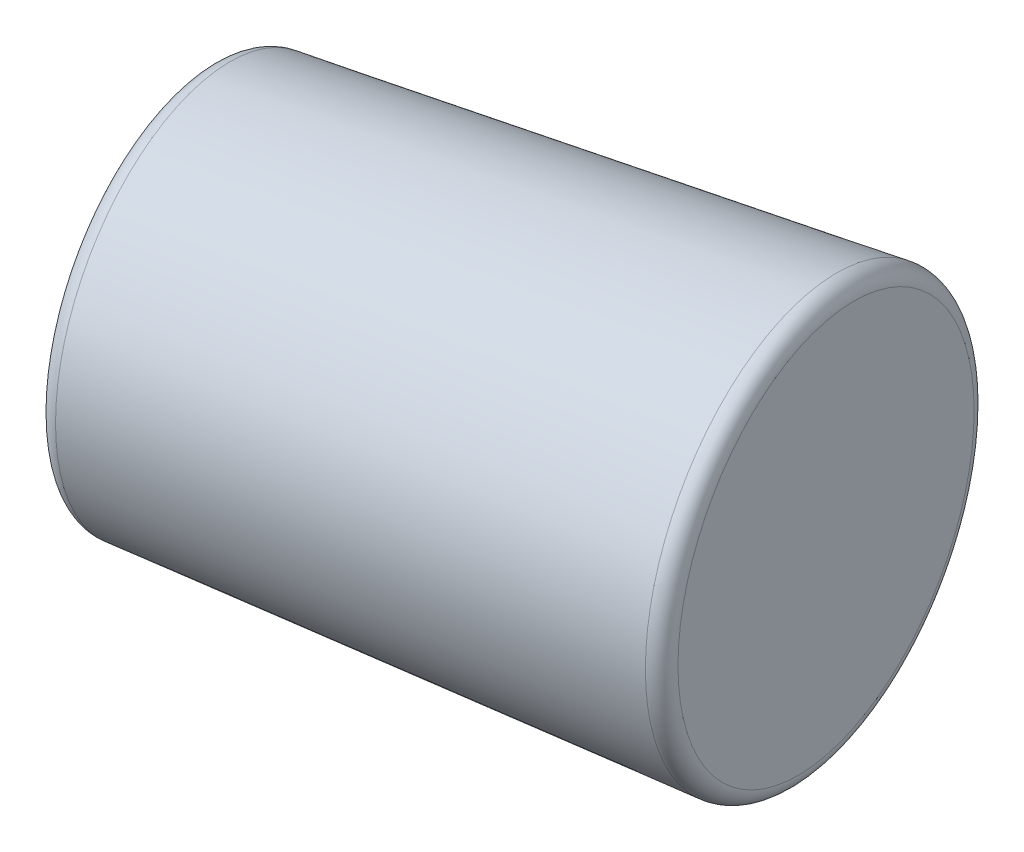
ISO-10303-21;
HEADER;
FILE_DESCRIPTION(('STEP AP214'),'2;1');
FILE_NAME('part.step','',(''),(''),'','','');
FILE_SCHEMA(('AUTOMOTIVE_DESIGN { 1 0 10303 214 1 1 1 1 }'));
ENDSEC;
DATA;
#1=APPLICATION_CONTEXT('core data for automotive mechanical design processes');
#2=APPLICATION_PROTOCOL_DEFINITION('international standard','automotive_design',2000,#1);
#3=PRODUCT_CONTEXT('',#1,'mechanical');
#4=PRODUCT('Part','Part','',(#3));
#5=PRODUCT_RELATED_PRODUCT_CATEGORY('part','',(#4));
#6=PRODUCT_DEFINITION_FORMATION('','',#4);
#7=PRODUCT_DEFINITION_CONTEXT('part definition',#1,'design');
#8=PRODUCT_DEFINITION('design','',#6,#7);
#9=PRODUCT_DEFINITION_SHAPE('','',#8);
#10=(LENGTH_UNIT() NAMED_UNIT(*) SI_UNIT(.MILLI.,.METRE.));
#11=(NAMED_UNIT(*) PLANE_ANGLE_UNIT() SI_UNIT($,.RADIAN.));
#12=(NAMED_UNIT(*) SI_UNIT($,.STERADIAN.) SOLID_ANGLE_UNIT());
#13=UNCERTAINTY_MEASURE_WITH_UNIT(LENGTH_MEASURE(1.E-05),#10,'distance_accuracy_value','');
#14=(GEOMETRIC_REPRESENTATION_CONTEXT(3) GLOBAL_UNCERTAINTY_ASSIGNED_CONTEXT((#13)) GLOBAL_UNIT_ASSIGNED_CONTEXT((#10,
#11,#12)) REPRESENTATION_CONTEXT('',''));
#15=CARTESIAN_POINT('',(0.,0.,0.));
#16=DIRECTION('',(0.,0.,1.));
#17=DIRECTION('',(1.,0.,0.));
#18=AXIS2_PLACEMENT_3D('',#15,#16,#17);
#19=CARTESIAN_POINT('',(3.49874319784223,0.,-20.0504340747262));
#20=DIRECTION('',(-0.981111765721869,0.,0.19344173066357));
#21=DIRECTION('',(0.19344173066357,0.,0.981111765721869));
#22=AXIS2_PLACEMENT_3D('',#19,#20,#21);
#23=PLANE('',#22);
#24=CARTESIAN_POINT('',(3.13077411195753,0.,-21.916726308284));
#25=DIRECTION('',(0.981111765721869,0.,-0.19344173066357));
#26=DIRECTION('',(-0.19344173066357,0.,-0.981111765721869));
#27=AXIS2_PLACEMENT_3D('',#24,#25,#26);
#28=CIRCLE('',#27,3.48254743494994);
#29=CARTESIAN_POINT('',(2.45710410902284,0.,-25.3334945713979));
#30=VERTEX_POINT('',#29);
#31=EDGE_CURVE('E61',#30,#30,#28,.F.);
#32=ORIENTED_EDGE('',*,*,#31,.T.);
#33=EDGE_LOOP('',(#32));
#34=FACE_BOUND('',#33,.T.);
#35=ADVANCED_FACE('F14',(#34),#23,.T.);
#36=CARTESIAN_POINT('',(14.525023724812,0.,-22.0251188623863));
#37=DIRECTION('',(0.981111765721869,0.,-0.19344173066357));
#38=DIRECTION('',(-0.19344173066357,0.,-0.981111765721869));
#39=AXIS2_PLACEMENT_3D('',#36,#37,#38);
#40=PLANE('',#39);
#41=CARTESIAN_POINT('',(14.1192258880425,0.,-24.083273691716));
#42=DIRECTION('',(-0.981111765721869,0.,0.19344173066357));
#43=DIRECTION('',(-0.19344173066357,0.,-0.981111765721869));
#44=AXIS2_PLACEMENT_3D('',#41,#42,#43);
#45=CIRCLE('',#44,3.85037954218825);
#46=CARTESIAN_POINT('',(13.37440180569,0.,-27.8609263630517));
#47=VERTEX_POINT('',#46);
#48=EDGE_CURVE('E29',#47,#47,#45,.F.);
#49=ORIENTED_EDGE('',*,*,#48,.T.);
#50=EDGE_LOOP('',(#49));
#51=FACE_BOUND('',#50,.T.);
#52=ADVANCED_FACE('F73',(#51),#40,.T.);
#53=CARTESIAN_POINT('',(3.45781136392778,0.,-21.9812068845271));
#54=DIRECTION('',(-0.981111765721869,0.,0.19344173066357));
#55=DIRECTION('',(0.,1.,0.));
#56=AXIS2_PLACEMENT_3D('',#53,#54,#55);
#57=TOROIDAL_SURFACE('',#56,3.48254743494994,0.33333333);
#58=ORIENTED_EDGE('',*,*,#31,.F.);
#59=EDGE_LOOP('',(#58));
#60=FACE_BOUND('',#59,.T.);
#61=CARTESIAN_POINT('',(3.44639792839477,0.,-21.9789565448619));
#62=DIRECTION('',(0.981111765721869,0.,-0.19344173066357));
#63=DIRECTION('',(0.193441730663568,0.,0.981111765721869));
#64=AXIS2_PLACEMENT_3D('',#61,#62,#63);
#65=CIRCLE('',#64,3.8156777081402);
#66=CARTESIAN_POINT('',(4.1845092279118,0.,-18.2353502512029));
#67=VERTEX_POINT('',#66);
#68=EDGE_CURVE('E24',#67,#67,#65,.T.);
#69=ORIENTED_EDGE('',*,*,#68,.F.);
#70=EDGE_LOOP('',(#69));
#71=FACE_BOUND('',#70,.T.);
#72=ADVANCED_FACE('F42',(#60,#71),#57,.T.);
#73=CARTESIAN_POINT('',(13.7921886360722,0.,-24.0187931154729));
#74=DIRECTION('',(0.981111765721869,0.,-0.19344173066357));
#75=DIRECTION('',(0.,-1.,0.));
#76=AXIS2_PLACEMENT_3D('',#73,#74,#75);
#77=TOROIDAL_SURFACE('',#76,3.85037954218825,0.333333329999999);
#78=ORIENTED_EDGE('',*,*,#48,.F.);
#79=EDGE_LOOP('',(#78));
#80=FACE_BOUND('',#79,.T.);
#81=CARTESIAN_POINT('',(13.7807752005997,0.,-24.0165427758197));
#82=DIRECTION('',(0.981111765721869,0.,-0.19344173066357));
#83=DIRECTION('',(0.193441730663567,0.,0.981111765721869));
#84=AXIS2_PLACEMENT_3D('',#81,#82,#83);
#85=CIRCLE('',#84,4.18350981368868);
#86=CARTESIAN_POINT('',(14.5900405792077,0.,-19.9120520755969));
#87=VERTEX_POINT('',#86);
#88=EDGE_CURVE('E10',#87,#87,#85,.F.);
#89=ORIENTED_EDGE('',*,*,#88,.F.);
#90=EDGE_LOOP('',(#89));
#91=FACE_BOUND('',#90,.T.);
#92=ADVANCED_FACE('F37',(#80,#91),#77,.T.);
#93=CARTESIAN_POINT('',(13.7807752004876,0.,-24.0165427757976));
#94=DIRECTION('',(0.981111765721869,0.,-0.193441730663568));
#95=DIRECTION('',(-0.193441730663568,0.,-0.981111765721869));
#96=AXIS2_PLACEMENT_3D('',#93,#94,#95);
#97=CONICAL_SURFACE('',#96,4.18350981368063,0.0349065850394539);
#98=ORIENTED_EDGE('',*,*,#68,.T.);
#99=EDGE_LOOP('',(#98));
#100=FACE_BOUND('',#99,.T.);
#101=ORIENTED_EDGE('',*,*,#88,.T.);
#102=EDGE_LOOP('',(#101));
#103=FACE_BOUND('',#102,.T.);
#104=ADVANCED_FACE('F41',(#100,#103),#97,.T.);
#105=CLOSED_SHELL('',(#35,#52,#72,#92,#104));
#106=MANIFOLD_SOLID_BREP('B1',#105);
#107=ADVANCED_BREP_SHAPE_REPRESENTATION('',(#18,#106),#14);
#108=SHAPE_DEFINITION_REPRESENTATION(#9,#107);
ENDSEC;
END-ISO-10303-21;
